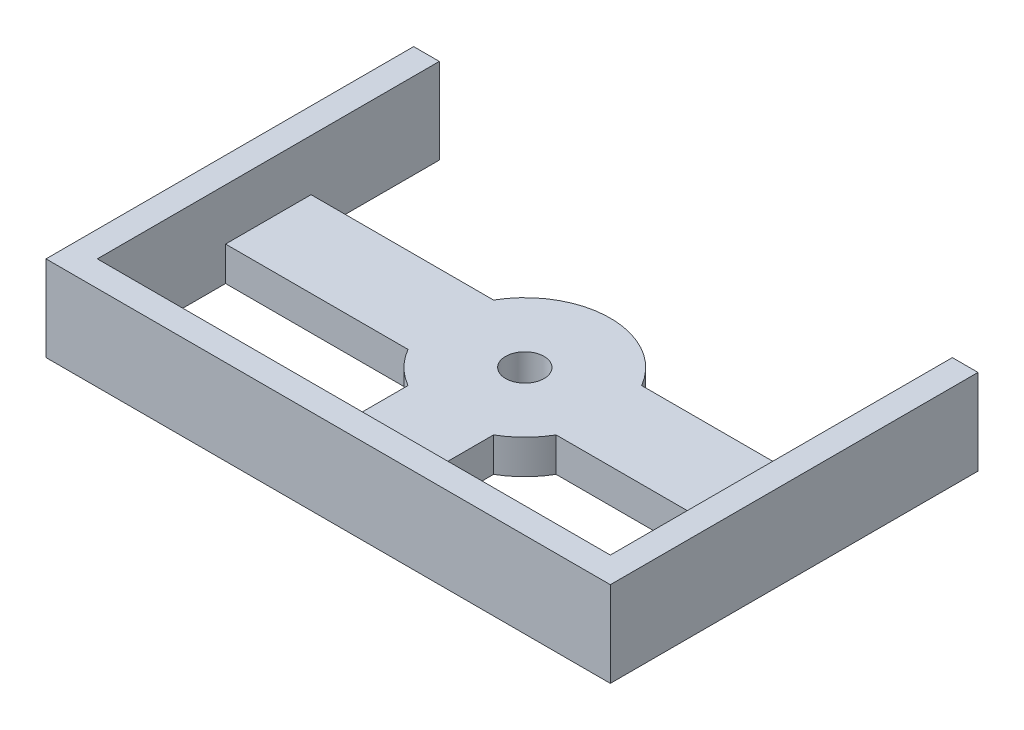
ISO-10303-21;
HEADER;
FILE_DESCRIPTION(('STEP AP214'),'2;1');
FILE_NAME('part.step','',(''),(''),'','','');
FILE_SCHEMA(('AUTOMOTIVE_DESIGN { 1 0 10303 214 1 1 1 1 }'));
ENDSEC;
DATA;
#1=APPLICATION_CONTEXT('core data for automotive mechanical design processes');
#2=APPLICATION_PROTOCOL_DEFINITION('international standard','automotive_design',2000,#1);
#3=PRODUCT_CONTEXT('',#1,'mechanical');
#4=PRODUCT('Part','Part','',(#3));
#5=PRODUCT_RELATED_PRODUCT_CATEGORY('part','',(#4));
#6=PRODUCT_DEFINITION_FORMATION('','',#4);
#7=PRODUCT_DEFINITION_CONTEXT('part definition',#1,'design');
#8=PRODUCT_DEFINITION('design','',#6,#7);
#9=PRODUCT_DEFINITION_SHAPE('','',#8);
#10=(LENGTH_UNIT() NAMED_UNIT(*) SI_UNIT(.MILLI.,.METRE.));
#11=(NAMED_UNIT(*) PLANE_ANGLE_UNIT() SI_UNIT($,.RADIAN.));
#12=(NAMED_UNIT(*) SI_UNIT($,.STERADIAN.) SOLID_ANGLE_UNIT());
#13=UNCERTAINTY_MEASURE_WITH_UNIT(LENGTH_MEASURE(1.E-05),#10,'distance_accuracy_value','');
#14=(GEOMETRIC_REPRESENTATION_CONTEXT(3) GLOBAL_UNCERTAINTY_ASSIGNED_CONTEXT((#13)) GLOBAL_UNIT_ASSIGNED_CONTEXT((#10,
#11,#12)) REPRESENTATION_CONTEXT('',''));
#15=CARTESIAN_POINT('',(0.,0.,0.));
#16=DIRECTION('',(0.,0.,1.));
#17=DIRECTION('',(1.,0.,0.));
#18=AXIS2_PLACEMENT_3D('',#15,#16,#17);
#19=CARTESIAN_POINT('',(0.,10.,40.));
#20=DIRECTION('',(0.,0.,-1.));
#21=DIRECTION('',(-1.,0.,0.));
#22=AXIS2_PLACEMENT_3D('',#19,#20,#21);
#23=PLANE('',#22);
#24=DIRECTION('',(1.,0.,0.));
#25=VECTOR('',#24,1.);
#26=CARTESIAN_POINT('',(0.,0.,40.));
#27=LINE('',#26,#25);
#28=CARTESIAN_POINT('',(35.,0.,40.));
#29=VERTEX_POINT('',#28);
#30=CARTESIAN_POINT('',(60.,0.,40.));
#31=VERTEX_POINT('',#30);
#32=EDGE_CURVE('E235',#29,#31,#27,.T.);
#33=ORIENTED_EDGE('',*,*,#32,.F.);
#34=DIRECTION('',(0.,-1.,0.));
#35=VECTOR('',#34,1.);
#36=CARTESIAN_POINT('',(35.,4.,40.));
#37=LINE('',#36,#35);
#38=CARTESIAN_POINT('',(35.,4.,40.));
#39=VERTEX_POINT('',#38);
#40=EDGE_CURVE('E346',#39,#29,#37,.T.);
#41=ORIENTED_EDGE('',*,*,#40,.F.);
#42=DIRECTION('',(1.,0.,0.));
#43=VECTOR('',#42,1.);
#44=CARTESIAN_POINT('',(0.,4.,40.));
#45=LINE('',#44,#43);
#46=CARTESIAN_POINT('',(25.,4.,40.));
#47=VERTEX_POINT('',#46);
#48=EDGE_CURVE('E191',#47,#39,#45,.T.);
#49=ORIENTED_EDGE('',*,*,#48,.F.);
#50=DIRECTION('',(0.,-1.,0.));
#51=VECTOR('',#50,1.);
#52=CARTESIAN_POINT('',(25.,4.,40.));
#53=LINE('',#52,#51);
#54=CARTESIAN_POINT('',(25.,0.,40.));
#55=VERTEX_POINT('',#54);
#56=EDGE_CURVE('E348',#47,#55,#53,.T.);
#57=ORIENTED_EDGE('',*,*,#56,.T.);
#58=CARTESIAN_POINT('',(0.,0.,40.));
#59=VERTEX_POINT('',#58);
#60=EDGE_CURVE('E236',#59,#55,#27,.T.);
#61=ORIENTED_EDGE('',*,*,#60,.F.);
#62=DIRECTION('',(0.,-1.,0.));
#63=VECTOR('',#62,1.);
#64=CARTESIAN_POINT('',(0.,10.,40.));
#65=LINE('',#64,#63);
#66=CARTESIAN_POINT('',(0.,10.,40.));
#67=VERTEX_POINT('',#66);
#68=EDGE_CURVE('E255',#67,#59,#65,.T.);
#69=ORIENTED_EDGE('',*,*,#68,.F.);
#70=DIRECTION('',(1.,0.,0.));
#71=VECTOR('',#70,1.);
#72=CARTESIAN_POINT('',(0.,10.,40.));
#73=LINE('',#72,#71);
#74=CARTESIAN_POINT('',(60.,10.,40.));
#75=VERTEX_POINT('',#74);
#76=EDGE_CURVE('E218',#67,#75,#73,.T.);
#77=ORIENTED_EDGE('',*,*,#76,.T.);
#78=DIRECTION('',(0.,-1.,0.));
#79=VECTOR('',#78,1.);
#80=CARTESIAN_POINT('',(60.,10.,40.));
#81=LINE('',#80,#79);
#82=EDGE_CURVE('E258',#75,#31,#81,.T.);
#83=ORIENTED_EDGE('',*,*,#82,.T.);
#84=EDGE_LOOP('',(#33,#41,#49,#57,#61,#69,#77,#83));
#85=FACE_BOUND('',#84,.T.);
#86=ADVANCED_FACE('F37',(#85),#23,.T.);
#87=CARTESIAN_POINT('',(63.,10.,0.));
#88=DIRECTION('',(1.,0.,0.));
#89=DIRECTION('',(0.,0.,-1.));
#90=AXIS2_PLACEMENT_3D('',#87,#88,#89);
#91=PLANE('',#90);
#92=DIRECTION('',(0.,0.,1.));
#93=VECTOR('',#92,1.);
#94=CARTESIAN_POINT('',(63.,0.,0.));
#95=LINE('',#94,#93);
#96=CARTESIAN_POINT('',(63.,0.,0.));
#97=VERTEX_POINT('',#96);
#98=CARTESIAN_POINT('',(63.,0.,43.));
#99=VERTEX_POINT('',#98);
#100=EDGE_CURVE('E199',#97,#99,#95,.T.);
#101=ORIENTED_EDGE('',*,*,#100,.F.);
#102=DIRECTION('',(0.,-1.,0.));
#103=VECTOR('',#102,1.);
#104=CARTESIAN_POINT('',(63.,10.,0.));
#105=LINE('',#104,#103);
#106=CARTESIAN_POINT('',(63.,10.,0.));
#107=VERTEX_POINT('',#106);
#108=EDGE_CURVE('E11',#107,#97,#105,.T.);
#109=ORIENTED_EDGE('',*,*,#108,.F.);
#110=DIRECTION('',(0.,0.,1.));
#111=VECTOR('',#110,1.);
#112=CARTESIAN_POINT('',(63.,10.,0.));
#113=LINE('',#112,#111);
#114=CARTESIAN_POINT('',(63.,10.,43.));
#115=VERTEX_POINT('',#114);
#116=EDGE_CURVE('E208',#107,#115,#113,.T.);
#117=ORIENTED_EDGE('',*,*,#116,.T.);
#118=DIRECTION('',(0.,-1.,0.));
#119=VECTOR('',#118,1.);
#120=CARTESIAN_POINT('',(63.,10.,43.));
#121=LINE('',#120,#119);
#122=EDGE_CURVE('E227',#115,#99,#121,.T.);
#123=ORIENTED_EDGE('',*,*,#122,.T.);
#124=EDGE_LOOP('',(#101,#109,#117,#123));
#125=FACE_BOUND('',#124,.T.);
#126=ADVANCED_FACE('F39',(#125),#91,.T.);
#127=CARTESIAN_POINT('',(0.,10.,0.));
#128=DIRECTION('',(0.,0.,-1.));
#129=DIRECTION('',(-1.,0.,0.));
#130=AXIS2_PLACEMENT_3D('',#127,#128,#129);
#131=PLANE('',#130);
#132=DIRECTION('',(1.,0.,0.));
#133=VECTOR('',#132,1.);
#134=CARTESIAN_POINT('',(0.,0.,0.));
#135=LINE('',#134,#133);
#136=CARTESIAN_POINT('',(60.,0.,0.));
#137=VERTEX_POINT('',#136);
#138=EDGE_CURVE('E202',#137,#97,#135,.T.);
#139=ORIENTED_EDGE('',*,*,#138,.F.);
#140=DIRECTION('',(0.,-1.,0.));
#141=VECTOR('',#140,1.);
#142=CARTESIAN_POINT('',(60.,10.,0.));
#143=LINE('',#142,#141);
#144=CARTESIAN_POINT('',(60.,10.,0.));
#145=VERTEX_POINT('',#144);
#146=EDGE_CURVE('E45',#145,#137,#143,.T.);
#147=ORIENTED_EDGE('',*,*,#146,.F.);
#148=DIRECTION('',(1.,0.,0.));
#149=VECTOR('',#148,1.);
#150=CARTESIAN_POINT('',(0.,10.,0.));
#151=LINE('',#150,#149);
#152=EDGE_CURVE('E211',#145,#107,#151,.T.);
#153=ORIENTED_EDGE('',*,*,#152,.T.);
#154=ORIENTED_EDGE('',*,*,#108,.T.);
#155=EDGE_LOOP('',(#139,#147,#153,#154));
#156=FACE_BOUND('',#155,.T.);
#157=ADVANCED_FACE('F273',(#156),#131,.T.);
#158=CARTESIAN_POINT('',(60.,10.,0.));
#159=DIRECTION('',(1.,0.,0.));
#160=DIRECTION('',(0.,0.,-1.));
#161=AXIS2_PLACEMENT_3D('',#158,#159,#160);
#162=PLANE('',#161);
#163=DIRECTION('',(0.,0.,-1.));
#164=VECTOR('',#163,1.);
#165=CARTESIAN_POINT('',(60.,4.,0.));
#166=LINE('',#165,#164);
#167=CARTESIAN_POINT('',(60.,4.,25.));
#168=VERTEX_POINT('',#167);
#169=CARTESIAN_POINT('',(60.,4.,15.));
#170=VERTEX_POINT('',#169);
#171=EDGE_CURVE('E52',#168,#170,#166,.T.);
#172=ORIENTED_EDGE('',*,*,#171,.F.);
#173=DIRECTION('',(0.,-1.,0.));
#174=VECTOR('',#173,1.);
#175=CARTESIAN_POINT('',(60.,4.,25.));
#176=LINE('',#175,#174);
#177=CARTESIAN_POINT('',(60.,0.,25.));
#178=VERTEX_POINT('',#177);
#179=EDGE_CURVE('E204',#168,#178,#176,.T.);
#180=ORIENTED_EDGE('',*,*,#179,.T.);
#181=DIRECTION('',(0.,0.,1.));
#182=VECTOR('',#181,1.);
#183=CARTESIAN_POINT('',(60.,0.,0.));
#184=LINE('',#183,#182);
#185=EDGE_CURVE('E231',#178,#31,#184,.T.);
#186=ORIENTED_EDGE('',*,*,#185,.T.);
#187=ORIENTED_EDGE('',*,*,#82,.F.);
#188=DIRECTION('',(0.,0.,1.));
#189=VECTOR('',#188,1.);
#190=CARTESIAN_POINT('',(60.,10.,0.));
#191=LINE('',#190,#189);
#192=EDGE_CURVE('E215',#145,#75,#191,.T.);
#193=ORIENTED_EDGE('',*,*,#192,.F.);
#194=ORIENTED_EDGE('',*,*,#146,.T.);
#195=CARTESIAN_POINT('',(60.,0.,15.));
#196=VERTEX_POINT('',#195);
#197=EDGE_CURVE('E233',#137,#196,#184,.T.);
#198=ORIENTED_EDGE('',*,*,#197,.T.);
#199=DIRECTION('',(0.,-1.,0.));
#200=VECTOR('',#199,1.);
#201=CARTESIAN_POINT('',(60.,4.,15.));
#202=LINE('',#201,#200);
#203=EDGE_CURVE('E57',#170,#196,#202,.T.);
#204=ORIENTED_EDGE('',*,*,#203,.F.);
#205=EDGE_LOOP('',(#172,#180,#186,#187,#193,#194,#198,#204));
#206=FACE_BOUND('',#205,.T.);
#207=ADVANCED_FACE('F262',(#206),#162,.F.);
#208=CARTESIAN_POINT('',(0.,10.,0.));
#209=DIRECTION('',(1.,0.,0.));
#210=DIRECTION('',(0.,0.,-1.));
#211=AXIS2_PLACEMENT_3D('',#208,#209,#210);
#212=PLANE('',#211);
#213=DIRECTION('',(0.,-1.,0.));
#214=VECTOR('',#213,1.);
#215=CARTESIAN_POINT('',(0.,4.,15.));
#216=LINE('',#215,#214);
#217=CARTESIAN_POINT('',(0.,4.,15.));
#218=VERTEX_POINT('',#217);
#219=CARTESIAN_POINT('',(0.,0.,15.));
#220=VERTEX_POINT('',#219);
#221=EDGE_CURVE('E301',#218,#220,#216,.T.);
#222=ORIENTED_EDGE('',*,*,#221,.T.);
#223=DIRECTION('',(0.,0.,1.));
#224=VECTOR('',#223,1.);
#225=CARTESIAN_POINT('',(0.,0.,0.));
#226=LINE('',#225,#224);
#227=CARTESIAN_POINT('',(0.,0.,0.));
#228=VERTEX_POINT('',#227);
#229=EDGE_CURVE('E240',#228,#220,#226,.T.);
#230=ORIENTED_EDGE('',*,*,#229,.F.);
#231=DIRECTION('',(0.,-1.,0.));
#232=VECTOR('',#231,1.);
#233=CARTESIAN_POINT('',(0.,10.,0.));
#234=LINE('',#233,#232);
#235=CARTESIAN_POINT('',(0.,10.,0.));
#236=VERTEX_POINT('',#235);
#237=EDGE_CURVE('E253',#236,#228,#234,.T.);
#238=ORIENTED_EDGE('',*,*,#237,.F.);
#239=DIRECTION('',(0.,0.,1.));
#240=VECTOR('',#239,1.);
#241=CARTESIAN_POINT('',(0.,10.,0.));
#242=LINE('',#241,#240);
#243=EDGE_CURVE('E221',#236,#67,#242,.T.);
#244=ORIENTED_EDGE('',*,*,#243,.T.);
#245=ORIENTED_EDGE('',*,*,#68,.T.);
#246=CARTESIAN_POINT('',(0.,0.,25.));
#247=VERTEX_POINT('',#246);
#248=EDGE_CURVE('E239',#247,#59,#226,.T.);
#249=ORIENTED_EDGE('',*,*,#248,.F.);
#250=DIRECTION('',(0.,-1.,0.));
#251=VECTOR('',#250,1.);
#252=CARTESIAN_POINT('',(0.,4.,25.));
#253=LINE('',#252,#251);
#254=CARTESIAN_POINT('',(0.,4.,25.));
#255=VERTEX_POINT('',#254);
#256=EDGE_CURVE('E309',#255,#247,#253,.T.);
#257=ORIENTED_EDGE('',*,*,#256,.F.);
#258=DIRECTION('',(0.,0.,-1.));
#259=VECTOR('',#258,1.);
#260=CARTESIAN_POINT('',(0.,4.,0.));
#261=LINE('',#260,#259);
#262=EDGE_CURVE('E304',#255,#218,#261,.T.);
#263=ORIENTED_EDGE('',*,*,#262,.T.);
#264=EDGE_LOOP('',(#222,#230,#238,#244,#245,#249,#257,#263));
#265=FACE_BOUND('',#264,.T.);
#266=ADVANCED_FACE('F298',(#265),#212,.T.);
#267=CARTESIAN_POINT('',(-3.,0.,0.));
#268=VERTEX_POINT('',#267);
#269=EDGE_CURVE('E232',#268,#228,#135,.T.);
#270=ORIENTED_EDGE('',*,*,#269,.F.);
#271=DIRECTION('',(0.,-1.,0.));
#272=VECTOR('',#271,1.);
#273=CARTESIAN_POINT('',(-3.,10.,0.));
#274=LINE('',#273,#272);
#275=CARTESIAN_POINT('',(-3.,10.,0.));
#276=VERTEX_POINT('',#275);
#277=EDGE_CURVE('E251',#276,#268,#274,.T.);
#278=ORIENTED_EDGE('',*,*,#277,.F.);
#279=EDGE_CURVE('E216',#276,#236,#151,.T.);
#280=ORIENTED_EDGE('',*,*,#279,.T.);
#281=ORIENTED_EDGE('',*,*,#237,.T.);
#282=EDGE_LOOP('',(#270,#278,#280,#281));
#283=FACE_BOUND('',#282,.T.);
#284=ADVANCED_FACE('F292',(#283),#131,.T.);
#285=CARTESIAN_POINT('',(-3.,10.,0.));
#286=DIRECTION('',(1.,0.,0.));
#287=DIRECTION('',(0.,0.,-1.));
#288=AXIS2_PLACEMENT_3D('',#285,#286,#287);
#289=PLANE('',#288);
#290=DIRECTION('',(0.,0.,1.));
#291=VECTOR('',#290,1.);
#292=CARTESIAN_POINT('',(-3.,0.,0.));
#293=LINE('',#292,#291);
#294=CARTESIAN_POINT('',(-2.99999999999999,0.,43.));
#295=VERTEX_POINT('',#294);
#296=EDGE_CURVE('E243',#268,#295,#293,.T.);
#297=ORIENTED_EDGE('',*,*,#296,.T.);
#298=DIRECTION('',(0.,-1.,0.));
#299=VECTOR('',#298,1.);
#300=CARTESIAN_POINT('',(-2.99999999999999,10.,43.));
#301=LINE('',#300,#299);
#302=CARTESIAN_POINT('',(-2.99999999999999,10.,43.));
#303=VERTEX_POINT('',#302);
#304=EDGE_CURVE('E248',#303,#295,#301,.T.);
#305=ORIENTED_EDGE('',*,*,#304,.F.);
#306=DIRECTION('',(0.,0.,1.));
#307=VECTOR('',#306,1.);
#308=CARTESIAN_POINT('',(-3.,10.,0.));
#309=LINE('',#308,#307);
#310=EDGE_CURVE('E224',#276,#303,#309,.T.);
#311=ORIENTED_EDGE('',*,*,#310,.F.);
#312=ORIENTED_EDGE('',*,*,#277,.T.);
#313=EDGE_LOOP('',(#297,#305,#311,#312));
#314=FACE_BOUND('',#313,.T.);
#315=ADVANCED_FACE('F288',(#314),#289,.F.);
#316=CARTESIAN_POINT('',(0.,10.,43.));
#317=DIRECTION('',(0.,0.,-1.));
#318=DIRECTION('',(-1.,0.,0.));
#319=AXIS2_PLACEMENT_3D('',#316,#317,#318);
#320=PLANE('',#319);
#321=DIRECTION('',(1.,0.,0.));
#322=VECTOR('',#321,1.);
#323=CARTESIAN_POINT('',(0.,0.,43.));
#324=LINE('',#323,#322);
#325=EDGE_CURVE('E212',#295,#99,#324,.T.);
#326=ORIENTED_EDGE('',*,*,#325,.T.);
#327=ORIENTED_EDGE('',*,*,#122,.F.);
#328=DIRECTION('',(1.,0.,0.));
#329=VECTOR('',#328,1.);
#330=CARTESIAN_POINT('',(0.,10.,43.));
#331=LINE('',#330,#329);
#332=EDGE_CURVE('E226',#303,#115,#331,.T.);
#333=ORIENTED_EDGE('',*,*,#332,.F.);
#334=ORIENTED_EDGE('',*,*,#304,.T.);
#335=EDGE_LOOP('',(#326,#327,#333,#334));
#336=FACE_BOUND('',#335,.T.);
#337=ADVANCED_FACE('F283',(#336),#320,.F.);
#338=CARTESIAN_POINT('',(0.,10.,0.));
#339=DIRECTION('',(0.,1.,0.));
#340=DIRECTION('',(0.,0.,1.));
#341=AXIS2_PLACEMENT_3D('',#338,#339,#340);
#342=PLANE('',#341);
#343=ORIENTED_EDGE('',*,*,#116,.F.);
#344=ORIENTED_EDGE('',*,*,#152,.F.);
#345=ORIENTED_EDGE('',*,*,#192,.T.);
#346=ORIENTED_EDGE('',*,*,#76,.F.);
#347=ORIENTED_EDGE('',*,*,#243,.F.);
#348=ORIENTED_EDGE('',*,*,#279,.F.);
#349=ORIENTED_EDGE('',*,*,#310,.T.);
#350=ORIENTED_EDGE('',*,*,#332,.T.);
#351=EDGE_LOOP('',(#343,#344,#345,#346,#347,#348,#349,#350));
#352=FACE_BOUND('',#351,.T.);
#353=ADVANCED_FACE('F427',(#352),#342,.T.);
#354=CARTESIAN_POINT('',(0.,0.,0.));
#355=DIRECTION('',(0.,1.,0.));
#356=DIRECTION('',(0.,0.,1.));
#357=AXIS2_PLACEMENT_3D('',#354,#355,#356);
#358=PLANE('',#357);
#359=DIRECTION('',(-1.,0.,0.));
#360=VECTOR('',#359,1.);
#361=CARTESIAN_POINT('',(0.,0.,15.));
#362=LINE('',#361,#360);
#363=CARTESIAN_POINT('',(38.6602540378444,0.,15.));
#364=VERTEX_POINT('',#363);
#365=EDGE_CURVE('E272',#196,#364,#362,.T.);
#366=ORIENTED_EDGE('',*,*,#365,.F.);
#367=ORIENTED_EDGE('',*,*,#197,.F.);
#368=ORIENTED_EDGE('',*,*,#138,.T.);
#369=ORIENTED_EDGE('',*,*,#100,.T.);
#370=ORIENTED_EDGE('',*,*,#325,.F.);
#371=ORIENTED_EDGE('',*,*,#296,.F.);
#372=ORIENTED_EDGE('',*,*,#269,.T.);
#373=ORIENTED_EDGE('',*,*,#229,.T.);
#374=DIRECTION('',(1.,0.,0.));
#375=VECTOR('',#374,1.);
#376=CARTESIAN_POINT('',(0.,0.,15.));
#377=LINE('',#376,#375);
#378=CARTESIAN_POINT('',(21.3397459621556,0.,15.));
#379=VERTEX_POINT('',#378);
#380=EDGE_CURVE('E295',#220,#379,#377,.T.);
#381=ORIENTED_EDGE('',*,*,#380,.T.);
#382=CARTESIAN_POINT('',(30.,0.,20.));
#383=DIRECTION('',(0.,1.,0.));
#384=DIRECTION('',(0.,0.,1.));
#385=AXIS2_PLACEMENT_3D('',#382,#383,#384);
#386=CIRCLE('',#385,10.);
#387=EDGE_CURVE('E328',#364,#379,#386,.T.);
#388=ORIENTED_EDGE('',*,*,#387,.F.);
#389=EDGE_LOOP('',(#366,#367,#368,#369,#370,#371,#372,#373,#381,#388));
#390=FACE_BOUND('',#389,.T.);
#391=ORIENTED_EDGE('',*,*,#185,.F.);
#392=DIRECTION('',(-1.,0.,0.));
#393=VECTOR('',#392,1.);
#394=CARTESIAN_POINT('',(0.,0.,25.));
#395=LINE('',#394,#393);
#396=CARTESIAN_POINT('',(38.6602540378444,0.,25.));
#397=VERTEX_POINT('',#396);
#398=EDGE_CURVE('E324',#178,#397,#395,.T.);
#399=ORIENTED_EDGE('',*,*,#398,.T.);
#400=CARTESIAN_POINT('',(30.,0.,20.));
#401=DIRECTION('',(0.,1.,0.));
#402=DIRECTION('',(0.,0.,1.));
#403=AXIS2_PLACEMENT_3D('',#400,#401,#402);
#404=CIRCLE('',#403,10.);
#405=CARTESIAN_POINT('',(35.,0.,28.6602540378444));
#406=VERTEX_POINT('',#405);
#407=EDGE_CURVE('E326',#406,#397,#404,.T.);
#408=ORIENTED_EDGE('',*,*,#407,.F.);
#409=DIRECTION('',(0.,0.,-1.));
#410=VECTOR('',#409,1.);
#411=CARTESIAN_POINT('',(35.,0.,0.));
#412=LINE('',#411,#410);
#413=EDGE_CURVE('E198',#29,#406,#412,.T.);
#414=ORIENTED_EDGE('',*,*,#413,.F.);
#415=ORIENTED_EDGE('',*,*,#32,.T.);
#416=EDGE_LOOP('',(#391,#399,#408,#414,#415));
#417=FACE_BOUND('',#416,.T.);
#418=DIRECTION('',(1.,0.,0.));
#419=VECTOR('',#418,1.);
#420=CARTESIAN_POINT('',(0.,0.,25.));
#421=LINE('',#420,#419);
#422=CARTESIAN_POINT('',(21.3397459621556,0.,25.));
#423=VERTEX_POINT('',#422);
#424=EDGE_CURVE('E336',#247,#423,#421,.T.);
#425=ORIENTED_EDGE('',*,*,#424,.F.);
#426=ORIENTED_EDGE('',*,*,#248,.T.);
#427=ORIENTED_EDGE('',*,*,#60,.T.);
#428=DIRECTION('',(0.,0.,-1.));
#429=VECTOR('',#428,1.);
#430=CARTESIAN_POINT('',(25.,0.,0.));
#431=LINE('',#430,#429);
#432=CARTESIAN_POINT('',(25.,0.,28.6602540378444));
#433=VERTEX_POINT('',#432);
#434=EDGE_CURVE('E341',#55,#433,#431,.T.);
#435=ORIENTED_EDGE('',*,*,#434,.T.);
#436=CARTESIAN_POINT('',(30.,0.,20.));
#437=DIRECTION('',(0.,1.,0.));
#438=DIRECTION('',(0.,0.,1.));
#439=AXIS2_PLACEMENT_3D('',#436,#437,#438);
#440=CIRCLE('',#439,10.);
#441=EDGE_CURVE('E338',#423,#433,#440,.T.);
#442=ORIENTED_EDGE('',*,*,#441,.F.);
#443=EDGE_LOOP('',(#425,#426,#427,#435,#442));
#444=FACE_BOUND('',#443,.T.);
#445=CARTESIAN_POINT('',(30.,0.,20.));
#446=DIRECTION('',(0.,1.,0.));
#447=DIRECTION('',(0.,0.,1.));
#448=AXIS2_PLACEMENT_3D('',#445,#446,#447);
#449=CIRCLE('',#448,2.25);
#450=CARTESIAN_POINT('',(30.,0.,22.25));
#451=VERTEX_POINT('',#450);
#452=EDGE_CURVE('E195',#451,#451,#449,.T.);
#453=ORIENTED_EDGE('',*,*,#452,.T.);
#454=EDGE_LOOP('',(#453));
#455=FACE_BOUND('',#454,.T.);
#456=ADVANCED_FACE('F269',(#390,#417,#444,#455),#358,.F.);
#457=CARTESIAN_POINT('',(35.,4.,0.));
#458=DIRECTION('',(-1.,0.,0.));
#459=DIRECTION('',(0.,0.,1.));
#460=AXIS2_PLACEMENT_3D('',#457,#458,#459);
#461=PLANE('',#460);
#462=ORIENTED_EDGE('',*,*,#413,.T.);
#463=DIRECTION('',(0.,-1.,0.));
#464=VECTOR('',#463,1.);
#465=CARTESIAN_POINT('',(35.,4.,28.6602540378444));
#466=LINE('',#465,#464);
#467=CARTESIAN_POINT('',(35.,4.,28.6602540378444));
#468=VERTEX_POINT('',#467);
#469=EDGE_CURVE('E177',#468,#406,#466,.T.);
#470=ORIENTED_EDGE('',*,*,#469,.F.);
#471=DIRECTION('',(0.,0.,-1.));
#472=VECTOR('',#471,1.);
#473=CARTESIAN_POINT('',(35.,4.,0.));
#474=LINE('',#473,#472);
#475=EDGE_CURVE('E184',#39,#468,#474,.T.);
#476=ORIENTED_EDGE('',*,*,#475,.F.);
#477=ORIENTED_EDGE('',*,*,#40,.T.);
#478=EDGE_LOOP('',(#462,#470,#476,#477));
#479=FACE_BOUND('',#478,.T.);
#480=ADVANCED_FACE('F197',(#479),#461,.F.);
#481=CARTESIAN_POINT('',(30.,4.,20.));
#482=DIRECTION('',(0.,-1.,0.));
#483=DIRECTION('',(0.,0.,-1.));
#484=AXIS2_PLACEMENT_3D('',#481,#482,#483);
#485=CYLINDRICAL_SURFACE('',#484,10.);
#486=ORIENTED_EDGE('',*,*,#407,.T.);
#487=DIRECTION('',(0.,-1.,0.));
#488=VECTOR('',#487,1.);
#489=CARTESIAN_POINT('',(38.6602540378444,4.,25.));
#490=LINE('',#489,#488);
#491=CARTESIAN_POINT('',(38.6602540378444,4.,25.));
#492=VERTEX_POINT('',#491);
#493=EDGE_CURVE('E179',#492,#397,#490,.T.);
#494=ORIENTED_EDGE('',*,*,#493,.F.);
#495=CARTESIAN_POINT('',(30.,4.,20.));
#496=DIRECTION('',(0.,1.,0.));
#497=DIRECTION('',(0.,0.,1.));
#498=AXIS2_PLACEMENT_3D('',#495,#496,#497);
#499=CIRCLE('',#498,10.);
#500=EDGE_CURVE('E172',#468,#492,#499,.T.);
#501=ORIENTED_EDGE('',*,*,#500,.F.);
#502=ORIENTED_EDGE('',*,*,#469,.T.);
#503=EDGE_LOOP('',(#486,#494,#501,#502));
#504=FACE_BOUND('',#503,.T.);
#505=ADVANCED_FACE('F175',(#504),#485,.T.);
#506=CARTESIAN_POINT('',(0.,4.,25.));
#507=DIRECTION('',(0.,0.,1.));
#508=DIRECTION('',(1.,0.,0.));
#509=AXIS2_PLACEMENT_3D('',#506,#507,#508);
#510=PLANE('',#509);
#511=ORIENTED_EDGE('',*,*,#398,.F.);
#512=ORIENTED_EDGE('',*,*,#179,.F.);
#513=DIRECTION('',(-1.,0.,0.));
#514=VECTOR('',#513,1.);
#515=CARTESIAN_POINT('',(0.,4.,25.));
#516=LINE('',#515,#514);
#517=EDGE_CURVE('E183',#168,#492,#516,.T.);
#518=ORIENTED_EDGE('',*,*,#517,.T.);
#519=ORIENTED_EDGE('',*,*,#493,.T.);
#520=EDGE_LOOP('',(#511,#512,#518,#519));
#521=FACE_BOUND('',#520,.T.);
#522=ADVANCED_FACE('F325',(#521),#510,.T.);
#523=CARTESIAN_POINT('',(0.,4.,15.));
#524=DIRECTION('',(0.,0.,1.));
#525=DIRECTION('',(1.,0.,0.));
#526=AXIS2_PLACEMENT_3D('',#523,#524,#525);
#527=PLANE('',#526);
#528=ORIENTED_EDGE('',*,*,#365,.T.);
#529=DIRECTION('',(0.,-1.,0.));
#530=VECTOR('',#529,1.);
#531=CARTESIAN_POINT('',(38.6602540378444,4.,15.));
#532=LINE('',#531,#530);
#533=CARTESIAN_POINT('',(38.6602540378444,4.,15.));
#534=VERTEX_POINT('',#533);
#535=EDGE_CURVE('E311',#534,#364,#532,.T.);
#536=ORIENTED_EDGE('',*,*,#535,.F.);
#537=DIRECTION('',(-1.,0.,0.));
#538=VECTOR('',#537,1.);
#539=CARTESIAN_POINT('',(0.,4.,15.));
#540=LINE('',#539,#538);
#541=EDGE_CURVE('E384',#170,#534,#540,.T.);
#542=ORIENTED_EDGE('',*,*,#541,.F.);
#543=ORIENTED_EDGE('',*,*,#203,.T.);
#544=EDGE_LOOP('',(#528,#536,#542,#543));
#545=FACE_BOUND('',#544,.T.);
#546=ADVANCED_FACE('F390',(#545),#527,.F.);
#547=CARTESIAN_POINT('',(30.,4.,20.));
#548=DIRECTION('',(0.,-1.,0.));
#549=DIRECTION('',(0.,0.,-1.));
#550=AXIS2_PLACEMENT_3D('',#547,#548,#549);
#551=CYLINDRICAL_SURFACE('',#550,10.);
#552=ORIENTED_EDGE('',*,*,#387,.T.);
#553=DIRECTION('',(0.,-1.,0.));
#554=VECTOR('',#553,1.);
#555=CARTESIAN_POINT('',(21.3397459621556,4.,15.));
#556=LINE('',#555,#554);
#557=CARTESIAN_POINT('',(21.3397459621556,4.,15.));
#558=VERTEX_POINT('',#557);
#559=EDGE_CURVE('E308',#558,#379,#556,.T.);
#560=ORIENTED_EDGE('',*,*,#559,.F.);
#561=CARTESIAN_POINT('',(30.,4.,20.));
#562=DIRECTION('',(0.,1.,0.));
#563=DIRECTION('',(0.,0.,1.));
#564=AXIS2_PLACEMENT_3D('',#561,#562,#563);
#565=CIRCLE('',#564,10.);
#566=EDGE_CURVE('E382',#534,#558,#565,.T.);
#567=ORIENTED_EDGE('',*,*,#566,.F.);
#568=ORIENTED_EDGE('',*,*,#535,.T.);
#569=EDGE_LOOP('',(#552,#560,#567,#568));
#570=FACE_BOUND('',#569,.T.);
#571=ADVANCED_FACE('F394',(#570),#551,.T.);
#572=CARTESIAN_POINT('',(0.,4.,15.));
#573=DIRECTION('',(0.,0.,-1.));
#574=DIRECTION('',(-1.,0.,0.));
#575=AXIS2_PLACEMENT_3D('',#572,#573,#574);
#576=PLANE('',#575);
#577=ORIENTED_EDGE('',*,*,#380,.F.);
#578=ORIENTED_EDGE('',*,*,#221,.F.);
#579=DIRECTION('',(1.,0.,0.));
#580=VECTOR('',#579,1.);
#581=CARTESIAN_POINT('',(0.,4.,15.));
#582=LINE('',#581,#580);
#583=EDGE_CURVE('E380',#218,#558,#582,.T.);
#584=ORIENTED_EDGE('',*,*,#583,.T.);
#585=ORIENTED_EDGE('',*,*,#559,.T.);
#586=EDGE_LOOP('',(#577,#578,#584,#585));
#587=FACE_BOUND('',#586,.T.);
#588=ADVANCED_FACE('F395',(#587),#576,.T.);
#589=CARTESIAN_POINT('',(0.,4.,25.));
#590=DIRECTION('',(0.,0.,-1.));
#591=DIRECTION('',(-1.,0.,0.));
#592=AXIS2_PLACEMENT_3D('',#589,#590,#591);
#593=PLANE('',#592);
#594=ORIENTED_EDGE('',*,*,#424,.T.);
#595=DIRECTION('',(0.,-1.,0.));
#596=VECTOR('',#595,1.);
#597=CARTESIAN_POINT('',(21.3397459621556,4.,25.));
#598=LINE('',#597,#596);
#599=CARTESIAN_POINT('',(21.3397459621556,4.,25.));
#600=VERTEX_POINT('',#599);
#601=EDGE_CURVE('E314',#600,#423,#598,.T.);
#602=ORIENTED_EDGE('',*,*,#601,.F.);
#603=DIRECTION('',(1.,0.,0.));
#604=VECTOR('',#603,1.);
#605=CARTESIAN_POINT('',(0.,4.,25.));
#606=LINE('',#605,#604);
#607=EDGE_CURVE('E377',#255,#600,#606,.T.);
#608=ORIENTED_EDGE('',*,*,#607,.F.);
#609=ORIENTED_EDGE('',*,*,#256,.T.);
#610=EDGE_LOOP('',(#594,#602,#608,#609));
#611=FACE_BOUND('',#610,.T.);
#612=ADVANCED_FACE('F397',(#611),#593,.F.);
#613=CARTESIAN_POINT('',(30.,4.,20.));
#614=DIRECTION('',(0.,-1.,0.));
#615=DIRECTION('',(0.,0.,-1.));
#616=AXIS2_PLACEMENT_3D('',#613,#614,#615);
#617=CYLINDRICAL_SURFACE('',#616,10.);
#618=ORIENTED_EDGE('',*,*,#441,.T.);
#619=DIRECTION('',(0.,-1.,0.));
#620=VECTOR('',#619,1.);
#621=CARTESIAN_POINT('',(25.,4.,28.6602540378444));
#622=LINE('',#621,#620);
#623=CARTESIAN_POINT('',(25.,4.,28.6602540378444));
#624=VERTEX_POINT('',#623);
#625=EDGE_CURVE('E352',#624,#433,#622,.T.);
#626=ORIENTED_EDGE('',*,*,#625,.F.);
#627=CARTESIAN_POINT('',(30.,4.,20.));
#628=DIRECTION('',(0.,1.,0.));
#629=DIRECTION('',(0.,0.,1.));
#630=AXIS2_PLACEMENT_3D('',#627,#628,#629);
#631=CIRCLE('',#630,10.);
#632=EDGE_CURVE('E360',#600,#624,#631,.T.);
#633=ORIENTED_EDGE('',*,*,#632,.F.);
#634=ORIENTED_EDGE('',*,*,#601,.T.);
#635=EDGE_LOOP('',(#618,#626,#633,#634));
#636=FACE_BOUND('',#635,.T.);
#637=ADVANCED_FACE('F358',(#636),#617,.T.);
#638=CARTESIAN_POINT('',(25.,4.,0.));
#639=DIRECTION('',(-1.,0.,0.));
#640=DIRECTION('',(0.,0.,1.));
#641=AXIS2_PLACEMENT_3D('',#638,#639,#640);
#642=PLANE('',#641);
#643=ORIENTED_EDGE('',*,*,#434,.F.);
#644=ORIENTED_EDGE('',*,*,#56,.F.);
#645=DIRECTION('',(0.,0.,-1.));
#646=VECTOR('',#645,1.);
#647=CARTESIAN_POINT('',(25.,4.,0.));
#648=LINE('',#647,#646);
#649=EDGE_CURVE('E370',#47,#624,#648,.T.);
#650=ORIENTED_EDGE('',*,*,#649,.T.);
#651=ORIENTED_EDGE('',*,*,#625,.T.);
#652=EDGE_LOOP('',(#643,#644,#650,#651));
#653=FACE_BOUND('',#652,.T.);
#654=ADVANCED_FACE('F366',(#653),#642,.T.);
#655=CARTESIAN_POINT('',(30.,4.,20.));
#656=DIRECTION('',(0.,-1.,0.));
#657=DIRECTION('',(0.,0.,-1.));
#658=AXIS2_PLACEMENT_3D('',#655,#656,#657);
#659=CYLINDRICAL_SURFACE('',#658,2.25);
#660=CARTESIAN_POINT('',(30.,4.,20.));
#661=DIRECTION('',(0.,1.,0.));
#662=DIRECTION('',(0.,0.,1.));
#663=AXIS2_PLACEMENT_3D('',#660,#661,#662);
#664=CIRCLE('',#663,2.25);
#665=CARTESIAN_POINT('',(30.,4.,22.25));
#666=VERTEX_POINT('',#665);
#667=EDGE_CURVE('E349',#666,#666,#664,.T.);
#668=ORIENTED_EDGE('',*,*,#667,.T.);
#669=EDGE_LOOP('',(#668));
#670=FACE_BOUND('',#669,.T.);
#671=ORIENTED_EDGE('',*,*,#452,.F.);
#672=EDGE_LOOP('',(#671));
#673=FACE_BOUND('',#672,.T.);
#674=ADVANCED_FACE('F477',(#670,#673),#659,.F.);
#675=CARTESIAN_POINT('',(0.,4.,0.));
#676=DIRECTION('',(0.,1.,0.));
#677=DIRECTION('',(0.,0.,1.));
#678=AXIS2_PLACEMENT_3D('',#675,#676,#677);
#679=PLANE('',#678);
#680=ORIENTED_EDGE('',*,*,#475,.T.);
#681=ORIENTED_EDGE('',*,*,#500,.T.);
#682=ORIENTED_EDGE('',*,*,#517,.F.);
#683=ORIENTED_EDGE('',*,*,#171,.T.);
#684=ORIENTED_EDGE('',*,*,#541,.T.);
#685=ORIENTED_EDGE('',*,*,#566,.T.);
#686=ORIENTED_EDGE('',*,*,#583,.F.);
#687=ORIENTED_EDGE('',*,*,#262,.F.);
#688=ORIENTED_EDGE('',*,*,#607,.T.);
#689=ORIENTED_EDGE('',*,*,#632,.T.);
#690=ORIENTED_EDGE('',*,*,#649,.F.);
#691=ORIENTED_EDGE('',*,*,#48,.T.);
#692=EDGE_LOOP('',(#680,#681,#682,#683,#684,#685,#686,#687,#688,#689,#690,#691));
#693=FACE_BOUND('',#692,.T.);
#694=ORIENTED_EDGE('',*,*,#667,.F.);
#695=EDGE_LOOP('',(#694));
#696=FACE_BOUND('',#695,.T.);
#697=ADVANCED_FACE('F187',(#693,#696),#679,.T.);
#698=CLOSED_SHELL('',(#86,#126,#157,#207,#266,#284,#315,#337,#353,#456,#480,#505,#522,#546,#571,
#588,#612,#637,#654,#674,#697));
#699=MANIFOLD_SOLID_BREP('B2',#698);
#700=ADVANCED_BREP_SHAPE_REPRESENTATION('',(#18,#699),#14);
#701=SHAPE_DEFINITION_REPRESENTATION(#9,#700);
ENDSEC;
END-ISO-10303-21;
